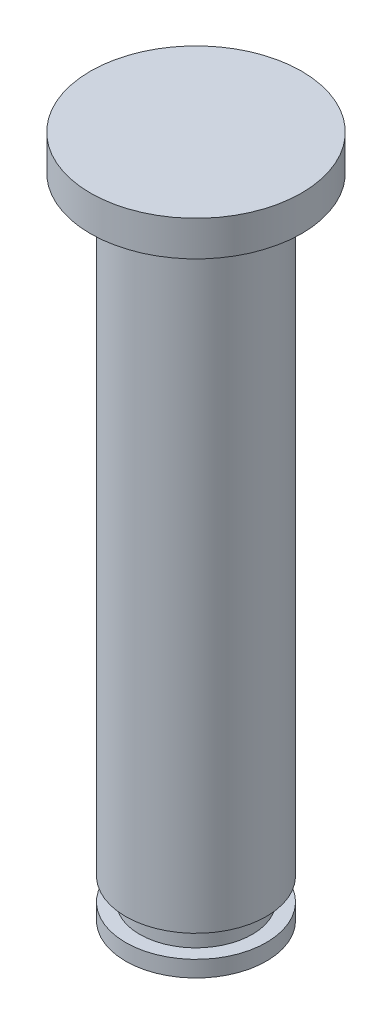
ISO-10303-21;
HEADER;
FILE_DESCRIPTION(('STEP AP214'),'2;1');
FILE_NAME('part.step','',(''),(''),'','','');
FILE_SCHEMA(('AUTOMOTIVE_DESIGN { 1 0 10303 214 1 1 1 1 }'));
ENDSEC;
DATA;
#1=APPLICATION_CONTEXT('core data for automotive mechanical design processes');
#2=APPLICATION_PROTOCOL_DEFINITION('international standard','automotive_design',2000,#1);
#3=PRODUCT_CONTEXT('',#1,'mechanical');
#4=PRODUCT('Part','Part','',(#3));
#5=PRODUCT_RELATED_PRODUCT_CATEGORY('part','',(#4));
#6=PRODUCT_DEFINITION_FORMATION('','',#4);
#7=PRODUCT_DEFINITION_CONTEXT('part definition',#1,'design');
#8=PRODUCT_DEFINITION('design','',#6,#7);
#9=PRODUCT_DEFINITION_SHAPE('','',#8);
#10=(LENGTH_UNIT() NAMED_UNIT(*) SI_UNIT(.MILLI.,.METRE.));
#11=(NAMED_UNIT(*) PLANE_ANGLE_UNIT() SI_UNIT($,.RADIAN.));
#12=(NAMED_UNIT(*) SI_UNIT($,.STERADIAN.) SOLID_ANGLE_UNIT());
#13=UNCERTAINTY_MEASURE_WITH_UNIT(LENGTH_MEASURE(1.E-05),#10,'distance_accuracy_value','');
#14=(GEOMETRIC_REPRESENTATION_CONTEXT(3) GLOBAL_UNCERTAINTY_ASSIGNED_CONTEXT((#13)) GLOBAL_UNIT_ASSIGNED_CONTEXT((#10,
#11,#12)) REPRESENTATION_CONTEXT('',''));
#15=CARTESIAN_POINT('',(0.,0.,0.));
#16=DIRECTION('',(0.,0.,1.));
#17=DIRECTION('',(1.,0.,0.));
#18=AXIS2_PLACEMENT_3D('',#15,#16,#17);
#19=CARTESIAN_POINT('',(0.,9.2,0.));
#20=DIRECTION('',(0.,-1.,0.));
#21=DIRECTION('',(0.,0.,-1.));
#22=AXIS2_PLACEMENT_3D('',#19,#20,#21);
#23=CYLINDRICAL_SURFACE('',#22,1.);
#24=CARTESIAN_POINT('',(0.,0.55,0.));
#25=DIRECTION('',(0.,1.,0.));
#26=DIRECTION('',(0.,0.,1.));
#27=AXIS2_PLACEMENT_3D('',#24,#25,#26);
#28=CIRCLE('',#27,1.);
#29=CARTESIAN_POINT('',(0.,0.55,1.));
#30=VERTEX_POINT('',#29);
#31=EDGE_CURVE('E60',#30,#30,#28,.T.);
#32=ORIENTED_EDGE('',*,*,#31,.T.);
#33=EDGE_LOOP('',(#32));
#34=FACE_BOUND('',#33,.T.);
#35=CARTESIAN_POINT('',(0.,9.2,0.));
#36=DIRECTION('',(0.,1.,0.));
#37=DIRECTION('',(0.,0.,1.));
#38=AXIS2_PLACEMENT_3D('',#35,#36,#37);
#39=CIRCLE('',#38,1.);
#40=CARTESIAN_POINT('',(0.,9.2,1.));
#41=VERTEX_POINT('',#40);
#42=EDGE_CURVE('E10',#41,#41,#39,.T.);
#43=ORIENTED_EDGE('',*,*,#42,.F.);
#44=EDGE_LOOP('',(#43));
#45=FACE_BOUND('',#44,.T.);
#46=ADVANCED_FACE('F37',(#34,#45),#23,.T.);
#47=CARTESIAN_POINT('',(0.,9.7,0.));
#48=DIRECTION('',(0.,-1.,0.));
#49=DIRECTION('',(0.,0.,-1.));
#50=AXIS2_PLACEMENT_3D('',#47,#48,#49);
#51=CYLINDRICAL_SURFACE('',#50,1.5);
#52=CARTESIAN_POINT('',(0.,9.7,0.));
#53=DIRECTION('',(0.,1.,0.));
#54=DIRECTION('',(0.,0.,1.));
#55=AXIS2_PLACEMENT_3D('',#52,#53,#54);
#56=CIRCLE('',#55,1.5);
#57=CARTESIAN_POINT('',(0.,9.7,1.5));
#58=VERTEX_POINT('',#57);
#59=EDGE_CURVE('E47',#58,#58,#56,.T.);
#60=ORIENTED_EDGE('',*,*,#59,.F.);
#61=EDGE_LOOP('',(#60));
#62=FACE_BOUND('',#61,.T.);
#63=CARTESIAN_POINT('',(0.,9.2,0.));
#64=DIRECTION('',(0.,1.,0.));
#65=DIRECTION('',(0.,0.,1.));
#66=AXIS2_PLACEMENT_3D('',#63,#64,#65);
#67=CIRCLE('',#66,1.5);
#68=CARTESIAN_POINT('',(0.,9.2,1.5));
#69=VERTEX_POINT('',#68);
#70=EDGE_CURVE('E49',#69,#69,#67,.T.);
#71=ORIENTED_EDGE('',*,*,#70,.T.);
#72=EDGE_LOOP('',(#71));
#73=FACE_BOUND('',#72,.T.);
#74=ADVANCED_FACE('F85',(#62,#73),#51,.T.);
#75=CARTESIAN_POINT('',(0.,9.7,0.));
#76=DIRECTION('',(0.,1.,0.));
#77=DIRECTION('',(0.,0.,1.));
#78=AXIS2_PLACEMENT_3D('',#75,#76,#77);
#79=PLANE('',#78);
#80=ORIENTED_EDGE('',*,*,#59,.T.);
#81=EDGE_LOOP('',(#80));
#82=FACE_BOUND('',#81,.T.);
#83=ADVANCED_FACE('F90',(#82),#79,.T.);
#84=CARTESIAN_POINT('',(0.,9.2,0.));
#85=DIRECTION('',(0.,1.,0.));
#86=DIRECTION('',(0.,0.,1.));
#87=AXIS2_PLACEMENT_3D('',#84,#85,#86);
#88=PLANE('',#87);
#89=ORIENTED_EDGE('',*,*,#42,.T.);
#90=EDGE_LOOP('',(#89));
#91=FACE_BOUND('',#90,.T.);
#92=ORIENTED_EDGE('',*,*,#70,.F.);
#93=EDGE_LOOP('',(#92));
#94=FACE_BOUND('',#93,.T.);
#95=ADVANCED_FACE('F103',(#91,#94),#88,.F.);
#96=CARTESIAN_POINT('',(0.,0.229999999999999,1.));
#97=DIRECTION('',(0.,-1.,0.));
#98=DIRECTION('',(0.,0.,-1.));
#99=AXIS2_PLACEMENT_3D('',#96,#97,#98);
#100=PLANE('',#99);
#101=CARTESIAN_POINT('',(0.,0.229999999999999,0.));
#102=DIRECTION('',(0.,1.,0.));
#103=DIRECTION('',(0.,0.,1.));
#104=AXIS2_PLACEMENT_3D('',#101,#102,#103);
#105=CIRCLE('',#104,0.8);
#106=CARTESIAN_POINT('',(0.,0.229999999999999,0.8));
#107=VERTEX_POINT('',#106);
#108=EDGE_CURVE('E52',#107,#107,#105,.T.);
#109=ORIENTED_EDGE('',*,*,#108,.F.);
#110=EDGE_LOOP('',(#109));
#111=FACE_BOUND('',#110,.T.);
#112=CARTESIAN_POINT('',(0.,0.229999999999999,0.));
#113=DIRECTION('',(0.,1.,0.));
#114=DIRECTION('',(0.,0.,1.));
#115=AXIS2_PLACEMENT_3D('',#112,#113,#114);
#116=CIRCLE('',#115,1.);
#117=CARTESIAN_POINT('',(0.,0.229999999999999,1.));
#118=VERTEX_POINT('',#117);
#119=EDGE_CURVE('E63',#118,#118,#116,.T.);
#120=ORIENTED_EDGE('',*,*,#119,.T.);
#121=EDGE_LOOP('',(#120));
#122=FACE_BOUND('',#121,.T.);
#123=ADVANCED_FACE('F67',(#111,#122),#100,.F.);
#124=CARTESIAN_POINT('',(0.,9.2,0.));
#125=DIRECTION('',(0.,1.,0.));
#126=DIRECTION('',(0.,0.,1.));
#127=AXIS2_PLACEMENT_3D('',#124,#125,#126);
#128=CYLINDRICAL_SURFACE('',#127,0.8);
#129=CARTESIAN_POINT('',(0.,0.55,0.));
#130=DIRECTION('',(0.,1.,0.));
#131=DIRECTION('',(0.,0.,1.));
#132=AXIS2_PLACEMENT_3D('',#129,#130,#131);
#133=CIRCLE('',#132,0.8);
#134=CARTESIAN_POINT('',(0.,0.55,0.8));
#135=VERTEX_POINT('',#134);
#136=EDGE_CURVE('E57',#135,#135,#133,.T.);
#137=ORIENTED_EDGE('',*,*,#136,.F.);
#138=EDGE_LOOP('',(#137));
#139=FACE_BOUND('',#138,.T.);
#140=ORIENTED_EDGE('',*,*,#108,.T.);
#141=EDGE_LOOP('',(#140));
#142=FACE_BOUND('',#141,.T.);
#143=ADVANCED_FACE('F80',(#139,#142),#128,.T.);
#144=CARTESIAN_POINT('',(0.,0.55,0.8));
#145=DIRECTION('',(0.,1.,0.));
#146=DIRECTION('',(0.,0.,1.));
#147=AXIS2_PLACEMENT_3D('',#144,#145,#146);
#148=PLANE('',#147);
#149=ORIENTED_EDGE('',*,*,#31,.F.);
#150=EDGE_LOOP('',(#149));
#151=FACE_BOUND('',#150,.T.);
#152=ORIENTED_EDGE('',*,*,#136,.T.);
#153=EDGE_LOOP('',(#152));
#154=FACE_BOUND('',#153,.T.);
#155=ADVANCED_FACE('F76',(#151,#154),#148,.F.);
#156=CARTESIAN_POINT('',(0.,0.,0.));
#157=DIRECTION('',(0.,1.,0.));
#158=DIRECTION('',(0.,0.,1.));
#159=AXIS2_PLACEMENT_3D('',#156,#157,#158);
#160=PLANE('',#159);
#161=CARTESIAN_POINT('',(0.,0.,0.));
#162=DIRECTION('',(0.,1.,0.));
#163=DIRECTION('',(0.,0.,1.));
#164=AXIS2_PLACEMENT_3D('',#161,#162,#163);
#165=CIRCLE('',#164,1.);
#166=CARTESIAN_POINT('',(0.,0.,1.));
#167=VERTEX_POINT('',#166);
#168=EDGE_CURVE('E40',#167,#167,#165,.T.);
#169=ORIENTED_EDGE('',*,*,#168,.F.);
#170=EDGE_LOOP('',(#169));
#171=FACE_BOUND('',#170,.T.);
#172=ADVANCED_FACE('F72',(#171),#160,.F.);
#173=ORIENTED_EDGE('',*,*,#119,.F.);
#174=EDGE_LOOP('',(#173));
#175=FACE_BOUND('',#174,.T.);
#176=ORIENTED_EDGE('',*,*,#168,.T.);
#177=EDGE_LOOP('',(#176));
#178=FACE_BOUND('',#177,.T.);
#179=ADVANCED_FACE('F69',(#175,#178),#23,.T.);
#180=CLOSED_SHELL('',(#46,#74,#83,#95,#123,#143,#155,#172,#179));
#181=MANIFOLD_SOLID_BREP('B2',#180);
#182=ADVANCED_BREP_SHAPE_REPRESENTATION('',(#18,#181),#14);
#183=SHAPE_DEFINITION_REPRESENTATION(#9,#182);
ENDSEC;
END-ISO-10303-21;
